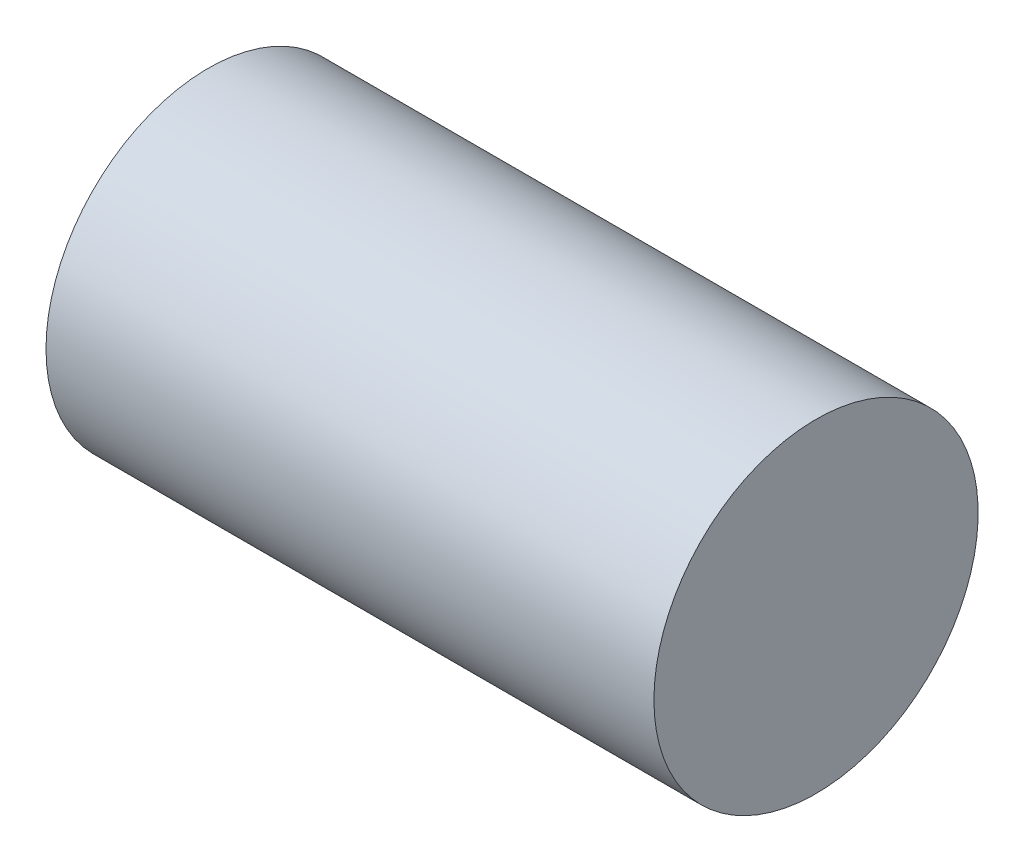
ISO-10303-21;
HEADER;
FILE_DESCRIPTION(('STEP AP214'),'2;1');
FILE_NAME('part.step','',(''),(''),'','','');
FILE_SCHEMA(('AUTOMOTIVE_DESIGN { 1 0 10303 214 1 1 1 1 }'));
ENDSEC;
DATA;
#1=APPLICATION_CONTEXT('core data for automotive mechanical design processes');
#2=APPLICATION_PROTOCOL_DEFINITION('international standard','automotive_design',2000,#1);
#3=PRODUCT_CONTEXT('',#1,'mechanical');
#4=PRODUCT('Part','Part','',(#3));
#5=PRODUCT_RELATED_PRODUCT_CATEGORY('part','',(#4));
#6=PRODUCT_DEFINITION_FORMATION('','',#4);
#7=PRODUCT_DEFINITION_CONTEXT('part definition',#1,'design');
#8=PRODUCT_DEFINITION('design','',#6,#7);
#9=PRODUCT_DEFINITION_SHAPE('','',#8);
#10=(LENGTH_UNIT() NAMED_UNIT(*) SI_UNIT(.MILLI.,.METRE.));
#11=(NAMED_UNIT(*) PLANE_ANGLE_UNIT() SI_UNIT($,.RADIAN.));
#12=(NAMED_UNIT(*) SI_UNIT($,.STERADIAN.) SOLID_ANGLE_UNIT());
#13=UNCERTAINTY_MEASURE_WITH_UNIT(LENGTH_MEASURE(1.E-05),#10,'distance_accuracy_value','');
#14=(GEOMETRIC_REPRESENTATION_CONTEXT(3) GLOBAL_UNCERTAINTY_ASSIGNED_CONTEXT((#13)) GLOBAL_UNIT_ASSIGNED_CONTEXT((#10,
#11,#12)) REPRESENTATION_CONTEXT('',''));
#15=CARTESIAN_POINT('',(0.,0.,0.));
#16=DIRECTION('',(0.,0.,1.));
#17=DIRECTION('',(1.,0.,0.));
#18=AXIS2_PLACEMENT_3D('',#15,#16,#17);
#19=CARTESIAN_POINT('',(-192.,0.,0.));
#20=DIRECTION('',(1.,0.,0.));
#21=DIRECTION('',(0.,0.,-1.));
#22=AXIS2_PLACEMENT_3D('',#19,#20,#21);
#23=CYLINDRICAL_SURFACE('',#22,8.);
#24=CARTESIAN_POINT('',(-192.,0.,0.));
#25=DIRECTION('',(-1.,0.,0.));
#26=DIRECTION('',(0.,0.,1.));
#27=AXIS2_PLACEMENT_3D('',#24,#25,#26);
#28=CIRCLE('',#27,8.);
#29=CARTESIAN_POINT('',(-192.,0.,8.));
#30=VERTEX_POINT('',#29);
#31=EDGE_CURVE('E10',#30,#30,#28,.T.);
#32=ORIENTED_EDGE('',*,*,#31,.F.);
#33=EDGE_LOOP('',(#32));
#34=FACE_BOUND('',#33,.T.);
#35=CARTESIAN_POINT('',(-162.,0.,0.));
#36=DIRECTION('',(-1.,0.,0.));
#37=DIRECTION('',(0.,0.,1.));
#38=AXIS2_PLACEMENT_3D('',#35,#36,#37);
#39=CIRCLE('',#38,8.);
#40=CARTESIAN_POINT('',(-162.,0.,8.));
#41=VERTEX_POINT('',#40);
#42=EDGE_CURVE('E34',#41,#41,#39,.T.);
#43=ORIENTED_EDGE('',*,*,#42,.T.);
#44=EDGE_LOOP('',(#43));
#45=FACE_BOUND('',#44,.T.);
#46=ADVANCED_FACE('F31',(#34,#45),#23,.T.);
#47=CARTESIAN_POINT('',(-192.,0.,0.));
#48=DIRECTION('',(-1.,0.,0.));
#49=DIRECTION('',(0.,0.,1.));
#50=AXIS2_PLACEMENT_3D('',#47,#48,#49);
#51=PLANE('',#50);
#52=ORIENTED_EDGE('',*,*,#31,.T.);
#53=EDGE_LOOP('',(#52));
#54=FACE_BOUND('',#53,.T.);
#55=ADVANCED_FACE('F46',(#54),#51,.T.);
#56=CARTESIAN_POINT('',(-162.,0.,0.));
#57=DIRECTION('',(-1.,0.,0.));
#58=DIRECTION('',(0.,0.,1.));
#59=AXIS2_PLACEMENT_3D('',#56,#57,#58);
#60=PLANE('',#59);
#61=ORIENTED_EDGE('',*,*,#42,.F.);
#62=EDGE_LOOP('',(#61));
#63=FACE_BOUND('',#62,.T.);
#64=ADVANCED_FACE('F44',(#63),#60,.F.);
#65=CLOSED_SHELL('',(#46,#55,#64));
#66=MANIFOLD_SOLID_BREP('B2',#65);
#67=ADVANCED_BREP_SHAPE_REPRESENTATION('',(#18,#66),#14);
#68=SHAPE_DEFINITION_REPRESENTATION(#9,#67);
ENDSEC;
END-ISO-10303-21;
